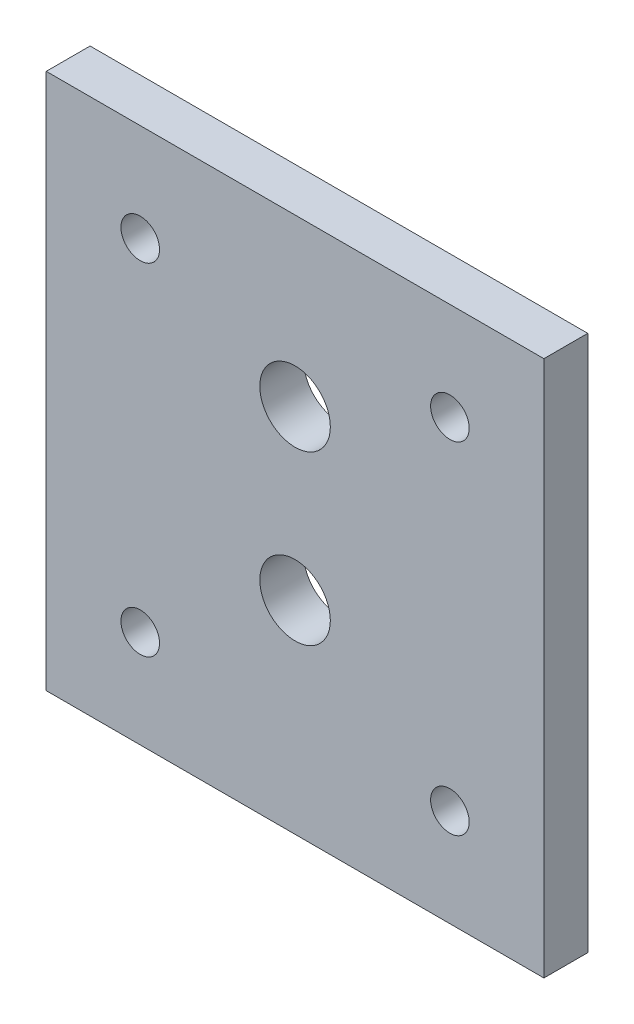
ISO-10303-21;
HEADER;
FILE_DESCRIPTION(('STEP AP214'),'2;1');
FILE_NAME('part.step','',(''),(''),'','','');
FILE_SCHEMA(('AUTOMOTIVE_DESIGN { 1 0 10303 214 1 1 1 1 }'));
ENDSEC;
DATA;
#1=APPLICATION_CONTEXT('core data for automotive mechanical design processes');
#2=APPLICATION_PROTOCOL_DEFINITION('international standard','automotive_design',2000,#1);
#3=PRODUCT_CONTEXT('',#1,'mechanical');
#4=PRODUCT('Part','Part','',(#3));
#5=PRODUCT_RELATED_PRODUCT_CATEGORY('part','',(#4));
#6=PRODUCT_DEFINITION_FORMATION('','',#4);
#7=PRODUCT_DEFINITION_CONTEXT('part definition',#1,'design');
#8=PRODUCT_DEFINITION('design','',#6,#7);
#9=PRODUCT_DEFINITION_SHAPE('','',#8);
#10=(LENGTH_UNIT() NAMED_UNIT(*) SI_UNIT(.MILLI.,.METRE.));
#11=(NAMED_UNIT(*) PLANE_ANGLE_UNIT() SI_UNIT($,.RADIAN.));
#12=(NAMED_UNIT(*) SI_UNIT($,.STERADIAN.) SOLID_ANGLE_UNIT());
#13=UNCERTAINTY_MEASURE_WITH_UNIT(LENGTH_MEASURE(1.E-05),#10,'distance_accuracy_value','');
#14=(GEOMETRIC_REPRESENTATION_CONTEXT(3) GLOBAL_UNCERTAINTY_ASSIGNED_CONTEXT((#13)) GLOBAL_UNIT_ASSIGNED_CONTEXT((#10,
#11,#12)) REPRESENTATION_CONTEXT('',''));
#15=CARTESIAN_POINT('',(0.,0.,0.));
#16=DIRECTION('',(0.,0.,1.));
#17=DIRECTION('',(1.,0.,0.));
#18=AXIS2_PLACEMENT_3D('',#15,#16,#17);
#19=CARTESIAN_POINT('',(0.,0.,3.175));
#20=DIRECTION('',(0.,0.,1.));
#21=DIRECTION('',(1.,0.,0.));
#22=AXIS2_PLACEMENT_3D('',#19,#20,#21);
#23=PLANE('',#22);
#24=CARTESIAN_POINT('',(34.7111476707963,-6.93737555205847,3.175));
#25=DIRECTION('',(0.,0.,1.));
#26=DIRECTION('',(1.,0.,0.));
#27=AXIS2_PLACEMENT_3D('',#24,#25,#26);
#28=CIRCLE('',#27,2.5527);
#29=CARTESIAN_POINT('',(37.2638476707963,-6.93737555205847,3.175));
#30=VERTEX_POINT('',#29);
#31=EDGE_CURVE('E133',#30,#30,#28,.T.);
#32=ORIENTED_EDGE('',*,*,#31,.F.);
#33=EDGE_LOOP('',(#32));
#34=FACE_BOUND('',#33,.T.);
#35=CARTESIAN_POINT('',(23.5033815167566,-26.6843921091761,3.175));
#36=DIRECTION('',(0.,0.,1.));
#37=DIRECTION('',(1.,0.,0.));
#38=AXIS2_PLACEMENT_3D('',#35,#36,#37);
#39=CIRCLE('',#38,1.397);
#40=CARTESIAN_POINT('',(24.9003815167566,-26.6843921091761,3.175));
#41=VERTEX_POINT('',#40);
#42=EDGE_CURVE('E121',#41,#41,#39,.T.);
#43=ORIENTED_EDGE('',*,*,#42,.F.);
#44=EDGE_LOOP('',(#43));
#45=FACE_BOUND('',#44,.T.);
#46=CARTESIAN_POINT('',(45.9189138248361,-2.00062141277905,3.175));
#47=DIRECTION('',(0.,0.,1.));
#48=DIRECTION('',(1.,0.,0.));
#49=AXIS2_PLACEMENT_3D('',#46,#47,#48);
#50=CIRCLE('',#49,1.39700000000001);
#51=CARTESIAN_POINT('',(47.3159138248361,-2.00062141277905,3.175));
#52=VERTEX_POINT('',#51);
#53=EDGE_CURVE('E100',#52,#52,#50,.T.);
#54=ORIENTED_EDGE('',*,*,#53,.F.);
#55=EDGE_LOOP('',(#54));
#56=FACE_BOUND('',#55,.T.);
#57=DIRECTION('',(0.,-1.,0.));
#58=VECTOR('',#57,1.);
#59=CARTESIAN_POINT('',(16.6986663518038,5.07094532726984,3.175));
#60=LINE('',#59,#58);
#61=CARTESIAN_POINT('',(16.6986663518038,5.07094532726984,3.175));
#62=VERTEX_POINT('',#61);
#63=CARTESIAN_POINT('',(16.6986663518038,-33.755958849225,3.175));
#64=VERTEX_POINT('',#63);
#65=EDGE_CURVE('E85',#62,#64,#60,.T.);
#66=ORIENTED_EDGE('',*,*,#65,.T.);
#67=DIRECTION('',(1.,0.,0.));
#68=VECTOR('',#67,1.);
#69=CARTESIAN_POINT('',(16.6986663518038,-33.755958849225,3.175));
#70=LINE('',#69,#68);
#71=CARTESIAN_POINT('',(52.7236289897888,-33.755958849225,3.175));
#72=VERTEX_POINT('',#71);
#73=EDGE_CURVE('E80',#64,#72,#70,.T.);
#74=ORIENTED_EDGE('',*,*,#73,.T.);
#75=DIRECTION('',(0.,1.,0.));
#76=VECTOR('',#75,1.);
#77=CARTESIAN_POINT('',(52.7236289897888,5.07094532726984,3.175));
#78=LINE('',#77,#76);
#79=CARTESIAN_POINT('',(52.7236289897888,5.07094532726984,3.175));
#80=VERTEX_POINT('',#79);
#81=EDGE_CURVE('E83',#72,#80,#78,.T.);
#82=ORIENTED_EDGE('',*,*,#81,.T.);
#83=DIRECTION('',(-1.,0.,0.));
#84=VECTOR('',#83,1.);
#85=CARTESIAN_POINT('',(16.6986663518038,5.07094532726984,3.175));
#86=LINE('',#85,#84);
#87=EDGE_CURVE('E50',#80,#62,#86,.T.);
#88=ORIENTED_EDGE('',*,*,#87,.T.);
#89=EDGE_LOOP('',(#66,#74,#82,#88));
#90=FACE_BOUND('',#89,.T.);
#91=CARTESIAN_POINT('',(23.5033815167566,-2.00062141277905,3.175));
#92=DIRECTION('',(0.,0.,1.));
#93=DIRECTION('',(1.,0.,0.));
#94=AXIS2_PLACEMENT_3D('',#91,#92,#93);
#95=CIRCLE('',#94,1.397);
#96=CARTESIAN_POINT('',(24.9003815167566,-2.00062141277905,3.175));
#97=VERTEX_POINT('',#96);
#98=EDGE_CURVE('E115',#97,#97,#95,.T.);
#99=ORIENTED_EDGE('',*,*,#98,.F.);
#100=EDGE_LOOP('',(#99));
#101=FACE_BOUND('',#100,.T.);
#102=CARTESIAN_POINT('',(45.9189138248361,-26.6843921091761,3.175));
#103=DIRECTION('',(0.,0.,1.));
#104=DIRECTION('',(1.,0.,0.));
#105=AXIS2_PLACEMENT_3D('',#102,#103,#104);
#106=CIRCLE('',#105,1.39700000000001);
#107=CARTESIAN_POINT('',(47.3159138248361,-26.6843921091761,3.175));
#108=VERTEX_POINT('',#107);
#109=EDGE_CURVE('E127',#108,#108,#106,.T.);
#110=ORIENTED_EDGE('',*,*,#109,.F.);
#111=EDGE_LOOP('',(#110));
#112=FACE_BOUND('',#111,.T.);
#113=CARTESIAN_POINT('',(34.7111476707963,-19.0791222189349,3.175));
#114=DIRECTION('',(0.,0.,1.));
#115=DIRECTION('',(1.,0.,0.));
#116=AXIS2_PLACEMENT_3D('',#113,#114,#115);
#117=CIRCLE('',#116,2.5527);
#118=CARTESIAN_POINT('',(37.2638476707963,-19.0791222189349,3.175));
#119=VERTEX_POINT('',#118);
#120=EDGE_CURVE('E139',#119,#119,#117,.T.);
#121=ORIENTED_EDGE('',*,*,#120,.F.);
#122=EDGE_LOOP('',(#121));
#123=FACE_BOUND('',#122,.T.);
#124=ADVANCED_FACE('F33',(#34,#45,#56,#90,#101,#112,#123),#23,.T.);
#125=CARTESIAN_POINT('',(0.,0.,0.));
#126=DIRECTION('',(0.,0.,1.));
#127=DIRECTION('',(1.,0.,0.));
#128=AXIS2_PLACEMENT_3D('',#125,#126,#127);
#129=PLANE('',#128);
#130=CARTESIAN_POINT('',(34.7111476707963,-6.93737555205847,0.));
#131=DIRECTION('',(0.,0.,1.));
#132=DIRECTION('',(1.,0.,0.));
#133=AXIS2_PLACEMENT_3D('',#130,#131,#132);
#134=CIRCLE('',#133,2.5527);
#135=CARTESIAN_POINT('',(37.2638476707963,-6.93737555205847,0.));
#136=VERTEX_POINT('',#135);
#137=EDGE_CURVE('E136',#136,#136,#134,.T.);
#138=ORIENTED_EDGE('',*,*,#137,.T.);
#139=EDGE_LOOP('',(#138));
#140=FACE_BOUND('',#139,.T.);
#141=CARTESIAN_POINT('',(23.5033815167566,-26.6843921091761,0.));
#142=DIRECTION('',(0.,0.,1.));
#143=DIRECTION('',(1.,0.,0.));
#144=AXIS2_PLACEMENT_3D('',#141,#142,#143);
#145=CIRCLE('',#144,1.397);
#146=CARTESIAN_POINT('',(24.9003815167566,-26.6843921091761,0.));
#147=VERTEX_POINT('',#146);
#148=EDGE_CURVE('E124',#147,#147,#145,.T.);
#149=ORIENTED_EDGE('',*,*,#148,.T.);
#150=EDGE_LOOP('',(#149));
#151=FACE_BOUND('',#150,.T.);
#152=CARTESIAN_POINT('',(45.9189138248361,-2.00062141277905,0.));
#153=DIRECTION('',(0.,0.,1.));
#154=DIRECTION('',(1.,0.,0.));
#155=AXIS2_PLACEMENT_3D('',#152,#153,#154);
#156=CIRCLE('',#155,1.39700000000001);
#157=CARTESIAN_POINT('',(47.3159138248361,-2.00062141277905,0.));
#158=VERTEX_POINT('',#157);
#159=EDGE_CURVE('E112',#158,#158,#156,.T.);
#160=ORIENTED_EDGE('',*,*,#159,.T.);
#161=EDGE_LOOP('',(#160));
#162=FACE_BOUND('',#161,.T.);
#163=DIRECTION('',(0.,-1.,0.));
#164=VECTOR('',#163,1.);
#165=CARTESIAN_POINT('',(16.6986663518038,5.07094532726984,0.));
#166=LINE('',#165,#164);
#167=CARTESIAN_POINT('',(16.6986663518038,5.07094532726984,0.));
#168=VERTEX_POINT('',#167);
#169=CARTESIAN_POINT('',(16.6986663518038,-33.755958849225,0.));
#170=VERTEX_POINT('',#169);
#171=EDGE_CURVE('E97',#168,#170,#166,.T.);
#172=ORIENTED_EDGE('',*,*,#171,.F.);
#173=DIRECTION('',(-1.,0.,0.));
#174=VECTOR('',#173,1.);
#175=CARTESIAN_POINT('',(16.6986663518038,5.07094532726984,0.));
#176=LINE('',#175,#174);
#177=CARTESIAN_POINT('',(52.7236289897888,5.07094532726984,0.));
#178=VERTEX_POINT('',#177);
#179=EDGE_CURVE('E73',#178,#168,#176,.T.);
#180=ORIENTED_EDGE('',*,*,#179,.F.);
#181=DIRECTION('',(0.,1.,0.));
#182=VECTOR('',#181,1.);
#183=CARTESIAN_POINT('',(52.7236289897888,5.07094532726984,0.));
#184=LINE('',#183,#182);
#185=CARTESIAN_POINT('',(52.7236289897888,-33.755958849225,0.));
#186=VERTEX_POINT('',#185);
#187=EDGE_CURVE('E67',#186,#178,#184,.T.);
#188=ORIENTED_EDGE('',*,*,#187,.F.);
#189=DIRECTION('',(1.,0.,0.));
#190=VECTOR('',#189,1.);
#191=CARTESIAN_POINT('',(16.6986663518038,-33.755958849225,0.));
#192=LINE('',#191,#190);
#193=EDGE_CURVE('E89',#170,#186,#192,.T.);
#194=ORIENTED_EDGE('',*,*,#193,.F.);
#195=EDGE_LOOP('',(#172,#180,#188,#194));
#196=FACE_BOUND('',#195,.T.);
#197=CARTESIAN_POINT('',(23.5033815167566,-2.00062141277905,0.));
#198=DIRECTION('',(0.,0.,1.));
#199=DIRECTION('',(1.,0.,0.));
#200=AXIS2_PLACEMENT_3D('',#197,#198,#199);
#201=CIRCLE('',#200,1.397);
#202=CARTESIAN_POINT('',(24.9003815167566,-2.00062141277905,0.));
#203=VERTEX_POINT('',#202);
#204=EDGE_CURVE('E118',#203,#203,#201,.T.);
#205=ORIENTED_EDGE('',*,*,#204,.T.);
#206=EDGE_LOOP('',(#205));
#207=FACE_BOUND('',#206,.T.);
#208=CARTESIAN_POINT('',(45.9189138248361,-26.6843921091761,0.));
#209=DIRECTION('',(0.,0.,1.));
#210=DIRECTION('',(1.,0.,0.));
#211=AXIS2_PLACEMENT_3D('',#208,#209,#210);
#212=CIRCLE('',#211,1.39700000000001);
#213=CARTESIAN_POINT('',(47.3159138248361,-26.6843921091761,0.));
#214=VERTEX_POINT('',#213);
#215=EDGE_CURVE('E130',#214,#214,#212,.T.);
#216=ORIENTED_EDGE('',*,*,#215,.T.);
#217=EDGE_LOOP('',(#216));
#218=FACE_BOUND('',#217,.T.);
#219=CARTESIAN_POINT('',(34.7111476707963,-19.0791222189349,0.));
#220=DIRECTION('',(0.,0.,1.));
#221=DIRECTION('',(1.,0.,0.));
#222=AXIS2_PLACEMENT_3D('',#219,#220,#221);
#223=CIRCLE('',#222,2.5527);
#224=CARTESIAN_POINT('',(37.2638476707963,-19.0791222189349,0.));
#225=VERTEX_POINT('',#224);
#226=EDGE_CURVE('E142',#225,#225,#223,.T.);
#227=ORIENTED_EDGE('',*,*,#226,.T.);
#228=EDGE_LOOP('',(#227));
#229=FACE_BOUND('',#228,.T.);
#230=ADVANCED_FACE('F108',(#140,#151,#162,#196,#207,#218,#229),#129,.F.);
#231=CARTESIAN_POINT('',(16.6986663518038,5.07094532726984,3.175));
#232=DIRECTION('',(1.,0.,0.));
#233=DIRECTION('',(0.,0.,-1.));
#234=AXIS2_PLACEMENT_3D('',#231,#232,#233);
#235=PLANE('',#234);
#236=ORIENTED_EDGE('',*,*,#171,.T.);
#237=DIRECTION('',(0.,0.,-1.));
#238=VECTOR('',#237,1.);
#239=CARTESIAN_POINT('',(16.6986663518038,-33.755958849225,3.175));
#240=LINE('',#239,#238);
#241=EDGE_CURVE('E11',#64,#170,#240,.T.);
#242=ORIENTED_EDGE('',*,*,#241,.F.);
#243=ORIENTED_EDGE('',*,*,#65,.F.);
#244=DIRECTION('',(0.,0.,-1.));
#245=VECTOR('',#244,1.);
#246=CARTESIAN_POINT('',(16.6986663518038,5.07094532726984,3.175));
#247=LINE('',#246,#245);
#248=EDGE_CURVE('E93',#62,#168,#247,.T.);
#249=ORIENTED_EDGE('',*,*,#248,.T.);
#250=EDGE_LOOP('',(#236,#242,#243,#249));
#251=FACE_BOUND('',#250,.T.);
#252=ADVANCED_FACE('F35',(#251),#235,.F.);
#253=CARTESIAN_POINT('',(16.6986663518038,-33.755958849225,3.175));
#254=DIRECTION('',(0.,1.,0.));
#255=DIRECTION('',(0.,0.,1.));
#256=AXIS2_PLACEMENT_3D('',#253,#254,#255);
#257=PLANE('',#256);
#258=ORIENTED_EDGE('',*,*,#193,.T.);
#259=DIRECTION('',(0.,0.,-1.));
#260=VECTOR('',#259,1.);
#261=CARTESIAN_POINT('',(52.7236289897888,-33.755958849225,3.175));
#262=LINE('',#261,#260);
#263=EDGE_CURVE('E42',#72,#186,#262,.T.);
#264=ORIENTED_EDGE('',*,*,#263,.F.);
#265=ORIENTED_EDGE('',*,*,#73,.F.);
#266=ORIENTED_EDGE('',*,*,#241,.T.);
#267=EDGE_LOOP('',(#258,#264,#265,#266));
#268=FACE_BOUND('',#267,.T.);
#269=ADVANCED_FACE('F88',(#268),#257,.F.);
#270=CARTESIAN_POINT('',(52.7236289897888,5.07094532726984,3.175));
#271=DIRECTION('',(-1.,0.,0.));
#272=DIRECTION('',(0.,0.,1.));
#273=AXIS2_PLACEMENT_3D('',#270,#271,#272);
#274=PLANE('',#273);
#275=ORIENTED_EDGE('',*,*,#187,.T.);
#276=DIRECTION('',(0.,0.,-1.));
#277=VECTOR('',#276,1.);
#278=CARTESIAN_POINT('',(52.7236289897888,5.07094532726984,3.175));
#279=LINE('',#278,#277);
#280=EDGE_CURVE('E90',#80,#178,#279,.T.);
#281=ORIENTED_EDGE('',*,*,#280,.F.);
#282=ORIENTED_EDGE('',*,*,#81,.F.);
#283=ORIENTED_EDGE('',*,*,#263,.T.);
#284=EDGE_LOOP('',(#275,#281,#282,#283));
#285=FACE_BOUND('',#284,.T.);
#286=ADVANCED_FACE('F91',(#285),#274,.F.);
#287=CARTESIAN_POINT('',(16.6986663518038,5.07094532726984,3.175));
#288=DIRECTION('',(0.,-1.,0.));
#289=DIRECTION('',(0.,0.,-1.));
#290=AXIS2_PLACEMENT_3D('',#287,#288,#289);
#291=PLANE('',#290);
#292=ORIENTED_EDGE('',*,*,#179,.T.);
#293=ORIENTED_EDGE('',*,*,#248,.F.);
#294=ORIENTED_EDGE('',*,*,#87,.F.);
#295=ORIENTED_EDGE('',*,*,#280,.T.);
#296=EDGE_LOOP('',(#292,#293,#294,#295));
#297=FACE_BOUND('',#296,.T.);
#298=ADVANCED_FACE('F105',(#297),#291,.F.);
#299=CARTESIAN_POINT('',(45.9189138248361,-2.00062141277905,3.175));
#300=DIRECTION('',(0.,0.,-1.));
#301=DIRECTION('',(-1.,0.,0.));
#302=AXIS2_PLACEMENT_3D('',#299,#300,#301);
#303=CYLINDRICAL_SURFACE('',#302,1.39700000000001);
#304=ORIENTED_EDGE('',*,*,#53,.T.);
#305=EDGE_LOOP('',(#304));
#306=FACE_BOUND('',#305,.T.);
#307=ORIENTED_EDGE('',*,*,#159,.F.);
#308=EDGE_LOOP('',(#307));
#309=FACE_BOUND('',#308,.T.);
#310=ADVANCED_FACE('F162',(#306,#309),#303,.F.);
#311=CARTESIAN_POINT('',(23.5033815167566,-2.00062141277905,3.175));
#312=DIRECTION('',(0.,0.,-1.));
#313=DIRECTION('',(-1.,0.,0.));
#314=AXIS2_PLACEMENT_3D('',#311,#312,#313);
#315=CYLINDRICAL_SURFACE('',#314,1.397);
#316=ORIENTED_EDGE('',*,*,#98,.T.);
#317=EDGE_LOOP('',(#316));
#318=FACE_BOUND('',#317,.T.);
#319=ORIENTED_EDGE('',*,*,#204,.F.);
#320=EDGE_LOOP('',(#319));
#321=FACE_BOUND('',#320,.T.);
#322=ADVANCED_FACE('F208',(#318,#321),#315,.F.);
#323=CARTESIAN_POINT('',(23.5033815167566,-26.6843921091761,3.175));
#324=DIRECTION('',(0.,0.,-1.));
#325=DIRECTION('',(-1.,0.,0.));
#326=AXIS2_PLACEMENT_3D('',#323,#324,#325);
#327=CYLINDRICAL_SURFACE('',#326,1.397);
#328=ORIENTED_EDGE('',*,*,#42,.T.);
#329=EDGE_LOOP('',(#328));
#330=FACE_BOUND('',#329,.T.);
#331=ORIENTED_EDGE('',*,*,#148,.F.);
#332=EDGE_LOOP('',(#331));
#333=FACE_BOUND('',#332,.T.);
#334=ADVANCED_FACE('F216',(#330,#333),#327,.F.);
#335=CARTESIAN_POINT('',(45.9189138248361,-26.6843921091761,3.175));
#336=DIRECTION('',(0.,0.,-1.));
#337=DIRECTION('',(-1.,0.,0.));
#338=AXIS2_PLACEMENT_3D('',#335,#336,#337);
#339=CYLINDRICAL_SURFACE('',#338,1.39700000000001);
#340=ORIENTED_EDGE('',*,*,#109,.T.);
#341=EDGE_LOOP('',(#340));
#342=FACE_BOUND('',#341,.T.);
#343=ORIENTED_EDGE('',*,*,#215,.F.);
#344=EDGE_LOOP('',(#343));
#345=FACE_BOUND('',#344,.T.);
#346=ADVANCED_FACE('F224',(#342,#345),#339,.F.);
#347=CARTESIAN_POINT('',(34.7111476707963,-6.93737555205847,3.175));
#348=DIRECTION('',(0.,0.,-1.));
#349=DIRECTION('',(-1.,0.,0.));
#350=AXIS2_PLACEMENT_3D('',#347,#348,#349);
#351=CYLINDRICAL_SURFACE('',#350,2.5527);
#352=ORIENTED_EDGE('',*,*,#31,.T.);
#353=EDGE_LOOP('',(#352));
#354=FACE_BOUND('',#353,.T.);
#355=ORIENTED_EDGE('',*,*,#137,.F.);
#356=EDGE_LOOP('',(#355));
#357=FACE_BOUND('',#356,.T.);
#358=ADVANCED_FACE('F233',(#354,#357),#351,.F.);
#359=CARTESIAN_POINT('',(34.7111476707963,-19.0791222189349,3.175));
#360=DIRECTION('',(0.,0.,-1.));
#361=DIRECTION('',(-1.,0.,0.));
#362=AXIS2_PLACEMENT_3D('',#359,#360,#361);
#363=CYLINDRICAL_SURFACE('',#362,2.5527);
#364=ORIENTED_EDGE('',*,*,#120,.T.);
#365=EDGE_LOOP('',(#364));
#366=FACE_BOUND('',#365,.T.);
#367=ORIENTED_EDGE('',*,*,#226,.F.);
#368=EDGE_LOOP('',(#367));
#369=FACE_BOUND('',#368,.T.);
#370=ADVANCED_FACE('F148',(#366,#369),#363,.F.);
#371=CLOSED_SHELL('',(#124,#230,#252,#269,#286,#298,#310,#322,#334,#346,#358,#370));
#372=MANIFOLD_SOLID_BREP('B2',#371);
#373=ADVANCED_BREP_SHAPE_REPRESENTATION('',(#18,#372),#14);
#374=SHAPE_DEFINITION_REPRESENTATION(#9,#373);
ENDSEC;
END-ISO-10303-21;
